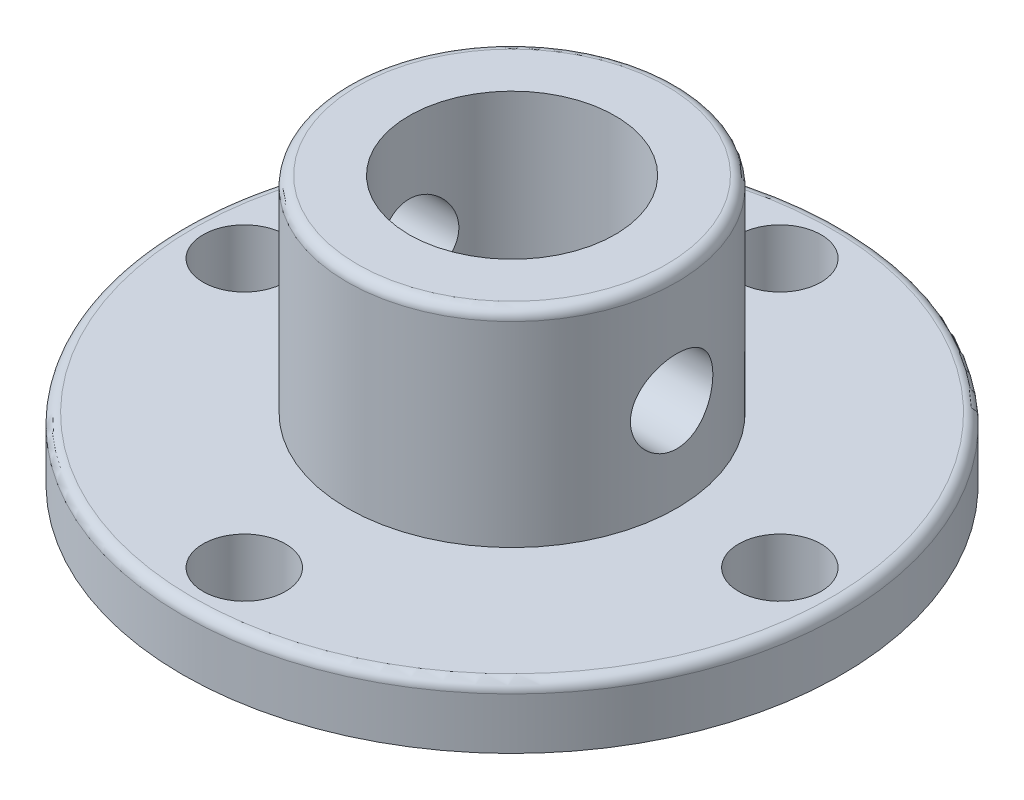
ISO-10303-21;
HEADER;
FILE_DESCRIPTION(('STEP AP214'),'2;1');
FILE_NAME('part.step','',(''),(''),'','','');
FILE_SCHEMA(('AUTOMOTIVE_DESIGN { 1 0 10303 214 1 1 1 1 }'));
ENDSEC;
DATA;
#1=APPLICATION_CONTEXT('core data for automotive mechanical design processes');
#2=APPLICATION_PROTOCOL_DEFINITION('international standard','automotive_design',2000,#1);
#3=PRODUCT_CONTEXT('',#1,'mechanical');
#4=PRODUCT('Part','Part','',(#3));
#5=PRODUCT_RELATED_PRODUCT_CATEGORY('part','',(#4));
#6=PRODUCT_DEFINITION_FORMATION('','',#4);
#7=PRODUCT_DEFINITION_CONTEXT('part definition',#1,'design');
#8=PRODUCT_DEFINITION('design','',#6,#7);
#9=PRODUCT_DEFINITION_SHAPE('','',#8);
#10=(LENGTH_UNIT() NAMED_UNIT(*) SI_UNIT(.MILLI.,.METRE.));
#11=(NAMED_UNIT(*) PLANE_ANGLE_UNIT() SI_UNIT($,.RADIAN.));
#12=(NAMED_UNIT(*) SI_UNIT($,.STERADIAN.) SOLID_ANGLE_UNIT());
#13=UNCERTAINTY_MEASURE_WITH_UNIT(LENGTH_MEASURE(1.E-05),#10,'distance_accuracy_value','');
#14=(GEOMETRIC_REPRESENTATION_CONTEXT(3) GLOBAL_UNCERTAINTY_ASSIGNED_CONTEXT((#13)) GLOBAL_UNIT_ASSIGNED_CONTEXT((#10,
#11,#12)) REPRESENTATION_CONTEXT('',''));
#15=CARTESIAN_POINT('',(0.,0.,0.));
#16=DIRECTION('',(0.,0.,1.));
#17=DIRECTION('',(1.,0.,0.));
#18=AXIS2_PLACEMENT_3D('',#15,#16,#17);
#19=CARTESIAN_POINT('',(0.,3.,0.));
#20=DIRECTION('',(0.,-1.,0.));
#21=DIRECTION('',(0.,0.,-1.));
#22=AXIS2_PLACEMENT_3D('',#19,#20,#21);
#23=CYLINDRICAL_SURFACE('',#22,16.);
#24=CARTESIAN_POINT('',(0.,2.5,0.));
#25=DIRECTION('',(0.,1.,0.));
#26=DIRECTION('',(0.,0.,1.));
#27=AXIS2_PLACEMENT_3D('',#24,#25,#26);
#28=CIRCLE('',#27,16.);
#29=CARTESIAN_POINT('',(0.,2.5,16.));
#30=VERTEX_POINT('',#29);
#31=EDGE_CURVE('E43',#30,#30,#28,.F.);
#32=ORIENTED_EDGE('',*,*,#31,.T.);
#33=EDGE_LOOP('',(#32));
#34=FACE_BOUND('',#33,.T.);
#35=CARTESIAN_POINT('',(0.,0.,0.));
#36=DIRECTION('',(0.,1.,0.));
#37=DIRECTION('',(0.,0.,1.));
#38=AXIS2_PLACEMENT_3D('',#35,#36,#37);
#39=CIRCLE('',#38,16.);
#40=CARTESIAN_POINT('',(0.,0.,16.));
#41=VERTEX_POINT('',#40);
#42=EDGE_CURVE('E52',#41,#41,#39,.T.);
#43=ORIENTED_EDGE('',*,*,#42,.T.);
#44=EDGE_LOOP('',(#43));
#45=FACE_BOUND('',#44,.T.);
#46=ADVANCED_FACE('F32',(#34,#45),#23,.T.);
#47=CARTESIAN_POINT('',(0.,3.,0.));
#48=DIRECTION('',(0.,1.,0.));
#49=DIRECTION('',(0.,0.,1.));
#50=AXIS2_PLACEMENT_3D('',#47,#48,#49);
#51=PLANE('',#50);
#52=CARTESIAN_POINT('',(0.,3.,0.));
#53=DIRECTION('',(0.,1.,0.));
#54=DIRECTION('',(0.,0.,1.));
#55=AXIS2_PLACEMENT_3D('',#52,#53,#54);
#56=CIRCLE('',#55,15.5);
#57=CARTESIAN_POINT('',(0.,3.,15.5));
#58=VERTEX_POINT('',#57);
#59=EDGE_CURVE('E47',#58,#58,#56,.T.);
#60=ORIENTED_EDGE('',*,*,#59,.T.);
#61=EDGE_LOOP('',(#60));
#62=FACE_BOUND('',#61,.T.);
#63=CARTESIAN_POINT('',(-13.,3.,0.));
#64=DIRECTION('',(0.,1.,0.));
#65=DIRECTION('',(0.,0.,1.));
#66=AXIS2_PLACEMENT_3D('',#63,#64,#65);
#67=CIRCLE('',#66,2.);
#68=CARTESIAN_POINT('',(-13.,3.,2.));
#69=VERTEX_POINT('',#68);
#70=EDGE_CURVE('E124',#69,#69,#67,.T.);
#71=ORIENTED_EDGE('',*,*,#70,.F.);
#72=EDGE_LOOP('',(#71));
#73=FACE_BOUND('',#72,.T.);
#74=CARTESIAN_POINT('',(0.,3.,13.));
#75=DIRECTION('',(0.,1.,0.));
#76=DIRECTION('',(0.,0.,1.));
#77=AXIS2_PLACEMENT_3D('',#74,#75,#76);
#78=CIRCLE('',#77,2.);
#79=CARTESIAN_POINT('',(0.,3.,15.));
#80=VERTEX_POINT('',#79);
#81=EDGE_CURVE('E128',#80,#80,#78,.T.);
#82=ORIENTED_EDGE('',*,*,#81,.F.);
#83=EDGE_LOOP('',(#82));
#84=FACE_BOUND('',#83,.T.);
#85=CARTESIAN_POINT('',(13.,3.,0.));
#86=DIRECTION('',(0.,1.,0.));
#87=DIRECTION('',(0.,0.,1.));
#88=AXIS2_PLACEMENT_3D('',#85,#86,#87);
#89=CIRCLE('',#88,2.);
#90=CARTESIAN_POINT('',(13.,3.,2.));
#91=VERTEX_POINT('',#90);
#92=EDGE_CURVE('E132',#91,#91,#89,.T.);
#93=ORIENTED_EDGE('',*,*,#92,.F.);
#94=EDGE_LOOP('',(#93));
#95=FACE_BOUND('',#94,.T.);
#96=CARTESIAN_POINT('',(0.,3.,-13.));
#97=DIRECTION('',(0.,1.,0.));
#98=DIRECTION('',(0.,0.,1.));
#99=AXIS2_PLACEMENT_3D('',#96,#97,#98);
#100=CIRCLE('',#99,2.);
#101=CARTESIAN_POINT('',(0.,3.,-11.));
#102=VERTEX_POINT('',#101);
#103=EDGE_CURVE('E136',#102,#102,#100,.T.);
#104=ORIENTED_EDGE('',*,*,#103,.F.);
#105=EDGE_LOOP('',(#104));
#106=FACE_BOUND('',#105,.T.);
#107=CARTESIAN_POINT('',(0.,3.,0.));
#108=DIRECTION('',(0.,1.,0.));
#109=DIRECTION('',(0.,0.,1.));
#110=AXIS2_PLACEMENT_3D('',#107,#108,#109);
#111=CIRCLE('',#110,8.);
#112=CARTESIAN_POINT('',(0.,3.,8.));
#113=VERTEX_POINT('',#112);
#114=EDGE_CURVE('E139',#113,#113,#111,.T.);
#115=ORIENTED_EDGE('',*,*,#114,.F.);
#116=EDGE_LOOP('',(#115));
#117=FACE_BOUND('',#116,.T.);
#118=ADVANCED_FACE('F101',(#62,#73,#84,#95,#106,#117),#51,.T.);
#119=CARTESIAN_POINT('',(0.,0.,0.));
#120=DIRECTION('',(0.,1.,0.));
#121=DIRECTION('',(0.,0.,1.));
#122=AXIS2_PLACEMENT_3D('',#119,#120,#121);
#123=PLANE('',#122);
#124=CARTESIAN_POINT('',(-13.,0.,0.));
#125=DIRECTION('',(0.,1.,0.));
#126=DIRECTION('',(0.,0.,1.));
#127=AXIS2_PLACEMENT_3D('',#124,#125,#126);
#128=CIRCLE('',#127,2.);
#129=CARTESIAN_POINT('',(-13.,0.,2.));
#130=VERTEX_POINT('',#129);
#131=EDGE_CURVE('E158',#130,#130,#128,.T.);
#132=ORIENTED_EDGE('',*,*,#131,.T.);
#133=EDGE_LOOP('',(#132));
#134=FACE_BOUND('',#133,.T.);
#135=CARTESIAN_POINT('',(0.,0.,13.));
#136=DIRECTION('',(0.,1.,0.));
#137=DIRECTION('',(0.,0.,1.));
#138=AXIS2_PLACEMENT_3D('',#135,#136,#137);
#139=CIRCLE('',#138,2.);
#140=CARTESIAN_POINT('',(0.,0.,15.));
#141=VERTEX_POINT('',#140);
#142=EDGE_CURVE('E156',#141,#141,#139,.T.);
#143=ORIENTED_EDGE('',*,*,#142,.T.);
#144=EDGE_LOOP('',(#143));
#145=FACE_BOUND('',#144,.T.);
#146=CARTESIAN_POINT('',(13.,0.,0.));
#147=DIRECTION('',(0.,1.,0.));
#148=DIRECTION('',(0.,0.,1.));
#149=AXIS2_PLACEMENT_3D('',#146,#147,#148);
#150=CIRCLE('',#149,2.);
#151=CARTESIAN_POINT('',(13.,0.,2.));
#152=VERTEX_POINT('',#151);
#153=EDGE_CURVE('E153',#152,#152,#150,.T.);
#154=ORIENTED_EDGE('',*,*,#153,.T.);
#155=EDGE_LOOP('',(#154));
#156=FACE_BOUND('',#155,.T.);
#157=CARTESIAN_POINT('',(0.,0.,-13.));
#158=DIRECTION('',(0.,1.,0.));
#159=DIRECTION('',(0.,0.,1.));
#160=AXIS2_PLACEMENT_3D('',#157,#158,#159);
#161=CIRCLE('',#160,2.);
#162=CARTESIAN_POINT('',(0.,0.,-11.));
#163=VERTEX_POINT('',#162);
#164=EDGE_CURVE('E150',#163,#163,#161,.T.);
#165=ORIENTED_EDGE('',*,*,#164,.T.);
#166=EDGE_LOOP('',(#165));
#167=FACE_BOUND('',#166,.T.);
#168=CARTESIAN_POINT('',(0.,0.,0.));
#169=DIRECTION('',(0.,1.,0.));
#170=DIRECTION('',(0.,0.,1.));
#171=AXIS2_PLACEMENT_3D('',#168,#169,#170);
#172=CIRCLE('',#171,5.);
#173=CARTESIAN_POINT('',(0.,0.,5.));
#174=VERTEX_POINT('',#173);
#175=EDGE_CURVE('E141',#174,#174,#172,.T.);
#176=ORIENTED_EDGE('',*,*,#175,.T.);
#177=EDGE_LOOP('',(#176));
#178=FACE_BOUND('',#177,.T.);
#179=ORIENTED_EDGE('',*,*,#42,.F.);
#180=EDGE_LOOP('',(#179));
#181=FACE_BOUND('',#180,.T.);
#182=ADVANCED_FACE('F100',(#134,#145,#156,#167,#178,#181),#123,.F.);
#183=CARTESIAN_POINT('',(0.,13.,0.));
#184=DIRECTION('',(0.,-1.,0.));
#185=DIRECTION('',(0.,0.,-1.));
#186=AXIS2_PLACEMENT_3D('',#183,#184,#185);
#187=CYLINDRICAL_SURFACE('',#186,8.);
#188=CARTESIAN_POINT('',(0.,12.5,0.));
#189=DIRECTION('',(0.,1.,0.));
#190=DIRECTION('',(0.,0.,1.));
#191=AXIS2_PLACEMENT_3D('',#188,#189,#190);
#192=CIRCLE('',#191,8.);
#193=CARTESIAN_POINT('',(0.,12.5,8.));
#194=VERTEX_POINT('',#193);
#195=EDGE_CURVE('E10',#194,#194,#192,.F.);
#196=ORIENTED_EDGE('',*,*,#195,.T.);
#197=EDGE_LOOP('',(#196));
#198=FACE_BOUND('',#197,.T.);
#199=CARTESIAN_POINT('',(-7.74596669241483,7.5,-2.));
#200=CARTESIAN_POINT('',(-7.74596880070288,7.61044060074126,-1.99999686287446));
#201=CARTESIAN_POINT('',(-7.74835444811678,7.72091591894282,-1.99082099639812));
#202=CARTESIAN_POINT('',(-7.75761489594051,7.93869406253881,-1.95441850037103));
#203=CARTESIAN_POINT('',(-7.76449230897304,8.04599500357455,-1.92718136539368));
#204=CARTESIAN_POINT('',(-7.7819097967692,8.25424283054975,-1.85559295970563));
#205=CARTESIAN_POINT('',(-7.79244514152366,8.35519772430857,-1.81126378228359));
#206=CARTESIAN_POINT('',(-7.81598553623007,8.54824868203191,-1.70681691300911));
#207=CARTESIAN_POINT('',(-7.82899069102791,8.64034436966417,-1.64669855084855));
#208=CARTESIAN_POINT('',(-7.856325730845,8.81508931620977,-1.5109667418495));
#209=CARTESIAN_POINT('',(-7.87067678098427,8.89751488028004,-1.43506951016324));
#210=CARTESIAN_POINT('',(-7.89890300412235,9.04860911548827,-1.27054565128053));
#211=CARTESIAN_POINT('',(-7.91277813253111,9.1172765004974,-1.18191783534425));
#212=CARTESIAN_POINT('',(-7.93872332416466,9.23982037410502,-0.992916160863164));
#213=CARTESIAN_POINT('',(-7.95076549920474,9.29347711052917,-0.892395660956097));
#214=CARTESIAN_POINT('',(-7.97144649540787,9.38304771532247,-0.683410547434211));
#215=CARTESIAN_POINT('',(-7.98008581867475,9.41896420153241,-0.574947108633554));
#216=CARTESIAN_POINT('',(-7.99283807078544,9.47131826766287,-0.355487007003331));
#217=CARTESIAN_POINT('',(-7.99703915075451,9.48813571546127,-0.244586175639182));
#218=CARTESIAN_POINT('',(-8.00074875285838,9.50300670342044,-0.0214630554102164));
#219=CARTESIAN_POINT('',(-8.00025796877363,9.50106301776768,0.0907590356304541));
#220=CARTESIAN_POINT('',(-7.99470475962828,9.47874011979988,0.310704494344773));
#221=CARTESIAN_POINT('',(-7.98974401872699,9.45877093995691,0.418472431202132));
#222=CARTESIAN_POINT('',(-7.97592669219883,9.4016229839612,0.629076494827371));
#223=CARTESIAN_POINT('',(-7.96706989918753,9.36444329169807,0.731912358740875));
#224=CARTESIAN_POINT('',(-7.94630007760717,9.27359794345035,0.930813407003612));
#225=CARTESIAN_POINT('',(-7.93436015756043,9.2197863642706,1.02680901953301));
#226=CARTESIAN_POINT('',(-7.90871923047719,9.09731545670699,1.20855124468098));
#227=CARTESIAN_POINT('',(-7.89501791721992,9.0286535451515,1.29429607017101));
#228=CARTESIAN_POINT('',(-7.86690971015616,8.8762330064141,1.45554807016991));
#229=CARTESIAN_POINT('',(-7.85249375620734,8.79211608612178,1.5307153581504));
#230=CARTESIAN_POINT('',(-7.82492034813365,8.6123200211678,1.66595275192604));
#231=CARTESIAN_POINT('',(-7.81176295284776,8.5166403364072,1.72602215209203));
#232=CARTESIAN_POINT('',(-7.78816397465319,8.31576797268083,1.82957625804519));
#233=CARTESIAN_POINT('',(-7.77773586980577,8.21053141574945,1.87297913394098));
#234=CARTESIAN_POINT('',(-7.76094912111966,7.99393162553884,1.94137124127268));
#235=CARTESIAN_POINT('',(-7.75458960648175,7.88256970881349,1.96636441310582));
#236=CARTESIAN_POINT('',(-7.74684284831312,7.6600323987815,1.99666371093214));
#237=CARTESIAN_POINT('',(-7.74532871274918,7.5489297653363,2.0024723791357));
#238=CARTESIAN_POINT('',(-7.74709874784831,7.32734245073747,1.99561359241244));
#239=CARTESIAN_POINT('',(-7.75038247681013,7.21685771363901,1.98294783827904));
#240=CARTESIAN_POINT('',(-7.76125665563648,7.00150858803624,1.93994037115013));
#241=CARTESIAN_POINT('',(-7.768775761875,6.89658181874333,1.9098912546254));
#242=CARTESIAN_POINT('',(-7.7872057461677,6.69325483371865,1.8332944653365));
#243=CARTESIAN_POINT('',(-7.79811702598891,6.59485539275573,1.78674483817004));
#244=CARTESIAN_POINT('',(-7.8223690967461,6.40524697770612,1.67741653434925));
#245=CARTESIAN_POINT('',(-7.83575334885313,6.31421692796552,1.6143374030685));
#246=CARTESIAN_POINT('',(-7.86333666457373,6.14384930975892,1.47412058586891));
#247=CARTESIAN_POINT('',(-7.87753586182776,6.06451366667994,1.39698058961088));
#248=CARTESIAN_POINT('',(-7.90557922425285,5.91775116594324,1.22852544196945));
#249=CARTESIAN_POINT('',(-7.91940561649468,5.85067194996095,1.13690390506319));
#250=CARTESIAN_POINT('',(-7.94477773290987,5.73285130643901,0.943405365389351));
#251=CARTESIAN_POINT('',(-7.95632357603169,5.68210902671344,0.841528897915183));
#252=CARTESIAN_POINT('',(-7.9757609259065,5.59884317237765,0.631116403462182));
#253=CARTESIAN_POINT('',(-7.98367864017925,5.56618857249675,0.522634762055765));
#254=CARTESIAN_POINT('',(-7.99508234716634,5.51963173231327,0.301499520637615));
#255=CARTESIAN_POINT('',(-7.99856919514738,5.50572587300877,0.188846730082482));
#256=CARTESIAN_POINT('',(-8.00068338817612,5.49726482084892,-0.0341670528866451));
#257=CARTESIAN_POINT('',(-7.99943957759977,5.50219658180918,-0.144507653932042));
#258=CARTESIAN_POINT('',(-7.99251792914887,5.5300956545887,-0.3627349928295));
#259=CARTESIAN_POINT('',(-7.98684022314338,5.55306243002634,-0.470621803561856));
#260=CARTESIAN_POINT('',(-7.97170865707778,5.61610443954172,-0.680342071289547));
#261=CARTESIAN_POINT('',(-7.96227529004785,5.65608690662876,-0.782204989161725));
#262=CARTESIAN_POINT('',(-7.94062577827316,5.75194115803914,-0.977834106083248));
#263=CARTESIAN_POINT('',(-7.92840928277515,5.80781494534097,-1.07159928253127));
#264=CARTESIAN_POINT('',(-7.90214499360574,5.93543046799226,-1.25080385684661));
#265=CARTESIAN_POINT('',(-7.88806033883329,6.00752028580766,-1.33598997659667));
#266=CARTESIAN_POINT('',(-7.85981298114379,6.16484570395469,-1.49323004054701));
#267=CARTESIAN_POINT('',(-7.84565025934604,6.25008463222232,-1.56528065015318));
#268=CARTESIAN_POINT('',(-7.81854951691005,6.43320282837892,-1.69552405294366));
#269=CARTESIAN_POINT('',(-7.80563927346578,6.53128824673051,-1.75343323883276));
#270=CARTESIAN_POINT('',(-7.78287910989656,6.73611097974964,-1.85185379317094));
#271=CARTESIAN_POINT('',(-7.77302696466427,6.84284193218769,-1.8923778195043));
#272=CARTESIAN_POINT('',(-7.75903817501475,7.04115402367032,-1.948845057142));
#273=CARTESIAN_POINT('',(-7.75417326006998,7.13178632877227,-1.96798634119376));
#274=CARTESIAN_POINT('',(-7.7476367716524,7.31493773799538,-1.99356458514354));
#275=CARTESIAN_POINT('',(-7.74596492578215,7.4074566804888,-2.0000026287435));
#276=CARTESIAN_POINT('',(-7.74596669241483,7.5,-2.));
#277=B_SPLINE_CURVE_WITH_KNOTS('',3,(#199,#200,#201,#202,#203,#204,#205,#206,#207,#208,#209,
#210,#211,#212,#213,#214,#215,#216,#217,#218,#219,#220,#221,#222,#223,#224,#225,#226,#227,#228,
#229,#230,#231,#232,#233,#234,#235,#236,#237,#238,#239,#240,#241,#242,#243,#244,#245,#246,#247,
#248,#249,#250,#251,#252,#253,#254,#255,#256,#257,#258,#259,#260,#261,#262,#263,#264,#265,#266,
#267,#268,#269,#270,#271,#272,#273,#274,#275,#276),.UNSPECIFIED.,.T.,.F.,(4,2,2,2,2,2,2,2,2,2,2,
2,2,2,2,2,2,2,2,2,2,2,2,2,2,2,2,2,2,2,2,2,2,2,2,2,2,2,4),(0.,0.330981953388908,
0.662156593142932,0.992904581732817,1.32366661404383,1.66099163354381,1.99834817183893,
2.34041197118336,2.68242527877674,3.01751000796277,3.35254518932816,3.68014610151157,
4.00776445379829,4.33834299403555,4.6689790837513,5.00856373257529,5.34816424959841,
5.68941145606722,6.03058560103638,6.36274859809374,6.69488101747042,7.02157924007365,
7.34831617137134,7.68146276687326,8.01466415108036,8.35620264772255,8.69772332575643,
9.03673658245543,9.3756843912723,9.70546756901965,10.0352409390158,10.3632390124777,
10.6912784459046,11.0271767726566,11.3631602525241,11.7054118182895,12.0474137709606,
12.3247826174462,12.6021278008238),.UNSPECIFIED.);
#278=CARTESIAN_POINT('',(-7.74596669241483,7.5,-2.));
#279=VERTEX_POINT('',#278);
#280=EDGE_CURVE('E90',#279,#279,#277,.T.);
#281=ORIENTED_EDGE('',*,*,#280,.T.);
#282=EDGE_LOOP('',(#281));
#283=FACE_BOUND('',#282,.T.);
#284=CARTESIAN_POINT('',(7.74596669241483,7.5,-2.));
#285=CARTESIAN_POINT('',(7.74596880070288,7.38955939925874,-1.99999686287446));
#286=CARTESIAN_POINT('',(7.74835444811678,7.27908408105718,-1.99082099639812));
#287=CARTESIAN_POINT('',(7.75761489594051,7.06130593746119,-1.95441850037103));
#288=CARTESIAN_POINT('',(7.76449230897304,6.95400499642545,-1.92718136539368));
#289=CARTESIAN_POINT('',(7.7819097967692,6.74575716945025,-1.85559295970563));
#290=CARTESIAN_POINT('',(7.79244514152366,6.64480227569143,-1.81126378228359));
#291=CARTESIAN_POINT('',(7.81598553623007,6.45175131796809,-1.70681691300911));
#292=CARTESIAN_POINT('',(7.82899069102791,6.35965563033583,-1.64669855084855));
#293=CARTESIAN_POINT('',(7.856325730845,6.18491068379023,-1.51096674184951));
#294=CARTESIAN_POINT('',(7.87067678098427,6.10248511971996,-1.43506951016324));
#295=CARTESIAN_POINT('',(7.89890300412235,5.95139088451173,-1.27054565128053));
#296=CARTESIAN_POINT('',(7.91277813253111,5.8827234995026,-1.18191783534425));
#297=CARTESIAN_POINT('',(7.93872332416466,5.76017962589498,-0.992916160863165));
#298=CARTESIAN_POINT('',(7.95076549920474,5.70652288947083,-0.892395660956097));
#299=CARTESIAN_POINT('',(7.97144649540787,5.61695228467753,-0.683410547434211));
#300=CARTESIAN_POINT('',(7.98008581867475,5.58103579846759,-0.574947108633553));
#301=CARTESIAN_POINT('',(7.99283807078544,5.52868173233713,-0.355487007003329));
#302=CARTESIAN_POINT('',(7.99703915075451,5.51186428453873,-0.24458617563918));
#303=CARTESIAN_POINT('',(8.00074875285838,5.49699329657956,-0.0214630554102154));
#304=CARTESIAN_POINT('',(8.00025796877363,5.49893698223232,0.0907590356304549));
#305=CARTESIAN_POINT('',(7.99470475962828,5.52125988020012,0.310704494344775));
#306=CARTESIAN_POINT('',(7.98974401872699,5.54122906004308,0.418472431202134));
#307=CARTESIAN_POINT('',(7.97592669219883,5.5983770160388,0.629076494827373));
#308=CARTESIAN_POINT('',(7.96706989918753,5.63555670830193,0.731912358740876));
#309=CARTESIAN_POINT('',(7.94630007760717,5.72640205654965,0.930813407003613));
#310=CARTESIAN_POINT('',(7.93436015756043,5.7802136357294,1.02680901953301));
#311=CARTESIAN_POINT('',(7.90871923047719,5.90268454329301,1.20855124468098));
#312=CARTESIAN_POINT('',(7.89501791721992,5.9713464548485,1.29429607017101));
#313=CARTESIAN_POINT('',(7.86690971015616,6.1237669935859,1.45554807016991));
#314=CARTESIAN_POINT('',(7.85249375620734,6.20788391387822,1.5307153581504));
#315=CARTESIAN_POINT('',(7.82492034813365,6.3876799788322,1.66595275192604));
#316=CARTESIAN_POINT('',(7.81176295284776,6.4833596635928,1.72602215209203));
#317=CARTESIAN_POINT('',(7.78816397465319,6.68423202731917,1.8295762580452));
#318=CARTESIAN_POINT('',(7.77773586980577,6.78946858425056,1.87297913394098));
#319=CARTESIAN_POINT('',(7.76094912111966,7.00606837446116,1.94137124127268));
#320=CARTESIAN_POINT('',(7.75458960648175,7.11743029118651,1.96636441310582));
#321=CARTESIAN_POINT('',(7.74684284831313,7.3399676012185,1.99666371093214));
#322=CARTESIAN_POINT('',(7.74532871274919,7.4510702346637,2.0024723791357));
#323=CARTESIAN_POINT('',(7.74709874784831,7.67265754926253,1.99561359241244));
#324=CARTESIAN_POINT('',(7.75038247681013,7.78314228636099,1.98294783827904));
#325=CARTESIAN_POINT('',(7.76125665563648,7.99849141196376,1.93994037115013));
#326=CARTESIAN_POINT('',(7.768775761875,8.10341818125668,1.9098912546254));
#327=CARTESIAN_POINT('',(7.7872057461677,8.30674516628135,1.8332944653365));
#328=CARTESIAN_POINT('',(7.79811702598891,8.40514460724427,1.78674483817004));
#329=CARTESIAN_POINT('',(7.8223690967461,8.59475302229388,1.67741653434925));
#330=CARTESIAN_POINT('',(7.83575334885313,8.68578307203448,1.6143374030685));
#331=CARTESIAN_POINT('',(7.86333666457373,8.85615069024108,1.47412058586891));
#332=CARTESIAN_POINT('',(7.87753586182776,8.93548633332006,1.39698058961088));
#333=CARTESIAN_POINT('',(7.90557922425285,9.08224883405676,1.22852544196945));
#334=CARTESIAN_POINT('',(7.91940561649468,9.14932805003905,1.13690390506318));
#335=CARTESIAN_POINT('',(7.94477773290987,9.26714869356099,0.94340536538935));
#336=CARTESIAN_POINT('',(7.95632357603169,9.31789097328656,0.841528897915181));
#337=CARTESIAN_POINT('',(7.9757609259065,9.40115682762235,0.631116403462181));
#338=CARTESIAN_POINT('',(7.98367864017925,9.43381142750325,0.522634762055765));
#339=CARTESIAN_POINT('',(7.99508234716634,9.48036826768673,0.301499520637615));
#340=CARTESIAN_POINT('',(7.99856919514738,9.49427412699123,0.188846730082481));
#341=CARTESIAN_POINT('',(8.00068338817612,9.50273517915108,-0.0341670528866464));
#342=CARTESIAN_POINT('',(7.99943957759977,9.49780341819082,-0.144507653932044));
#343=CARTESIAN_POINT('',(7.99251792914887,9.4699043454113,-0.362734992829502));
#344=CARTESIAN_POINT('',(7.98684022314338,9.44693756997366,-0.470621803561857));
#345=CARTESIAN_POINT('',(7.97170865707778,9.38389556045828,-0.680342071289548));
#346=CARTESIAN_POINT('',(7.96227529004785,9.34391309337124,-0.782204989161725));
#347=CARTESIAN_POINT('',(7.94062577827316,9.24805884196086,-0.977834106083247));
#348=CARTESIAN_POINT('',(7.92840928277515,9.19218505465903,-1.07159928253127));
#349=CARTESIAN_POINT('',(7.90214499360574,9.06456953200773,-1.25080385684661));
#350=CARTESIAN_POINT('',(7.88806033883329,8.99247971419234,-1.33598997659667));
#351=CARTESIAN_POINT('',(7.85981298114379,8.83515429604531,-1.49323004054701));
#352=CARTESIAN_POINT('',(7.84565025934604,8.74991536777767,-1.56528065015318));
#353=CARTESIAN_POINT('',(7.81854951691005,8.56679717162108,-1.69552405294366));
#354=CARTESIAN_POINT('',(7.80563927346578,8.46871175326949,-1.75343323883276));
#355=CARTESIAN_POINT('',(7.78287910989656,8.26388902025036,-1.85185379317094));
#356=CARTESIAN_POINT('',(7.77302696466428,8.15715806781231,-1.8923778195043));
#357=CARTESIAN_POINT('',(7.75903817501475,7.95884597632968,-1.948845057142));
#358=CARTESIAN_POINT('',(7.75417326006998,7.86821367122772,-1.96798634119376));
#359=CARTESIAN_POINT('',(7.7476367716524,7.68506226200462,-1.99356458514354));
#360=CARTESIAN_POINT('',(7.74596492578215,7.5925433195112,-2.0000026287435));
#361=CARTESIAN_POINT('',(7.74596669241483,7.5,-2.));
#362=B_SPLINE_CURVE_WITH_KNOTS('',3,(#284,#285,#286,#287,#288,#289,#290,#291,#292,#293,#294,
#295,#296,#297,#298,#299,#300,#301,#302,#303,#304,#305,#306,#307,#308,#309,#310,#311,#312,#313,
#314,#315,#316,#317,#318,#319,#320,#321,#322,#323,#324,#325,#326,#327,#328,#329,#330,#331,#332,
#333,#334,#335,#336,#337,#338,#339,#340,#341,#342,#343,#344,#345,#346,#347,#348,#349,#350,#351,
#352,#353,#354,#355,#356,#357,#358,#359,#360,#361),.UNSPECIFIED.,.T.,.F.,(4,2,2,2,2,2,2,2,2,2,2,
2,2,2,2,2,2,2,2,2,2,2,2,2,2,2,2,2,2,2,2,2,2,2,2,2,2,2,4),(0.,0.330981953388909,
0.662156593142932,0.992904581732817,1.32366661404383,1.66099163354381,1.99834817183893,
2.34041197118336,2.68242527877674,3.01751000796277,3.35254518932816,3.68014610151158,
4.00776445379829,4.33834299403556,4.66897908375131,5.00856373257529,5.34816424959842,
5.68941145606722,6.03058560103638,6.36274859809374,6.69488101747042,7.02157924007366,
7.34831617137134,7.68146276687326,8.01466415108036,8.35620264772255,8.69772332575643,
9.03673658245543,9.37568439127231,9.70546756901966,10.0352409390158,10.3632390124777,
10.6912784459046,11.0271767726566,11.3631602525241,11.7054118182895,12.0474137709606,
12.3247826174462,12.6021278008238),.UNSPECIFIED.);
#363=CARTESIAN_POINT('',(7.74596669241483,7.5,-2.));
#364=VERTEX_POINT('',#363);
#365=EDGE_CURVE('E61',#364,#364,#362,.T.);
#366=ORIENTED_EDGE('',*,*,#365,.T.);
#367=EDGE_LOOP('',(#366));
#368=FACE_BOUND('',#367,.T.);
#369=ORIENTED_EDGE('',*,*,#114,.T.);
#370=EDGE_LOOP('',(#369));
#371=FACE_BOUND('',#370,.T.);
#372=ADVANCED_FACE('F95',(#198,#283,#368,#371),#187,.T.);
#373=CARTESIAN_POINT('',(0.,13.,0.));
#374=DIRECTION('',(0.,1.,0.));
#375=DIRECTION('',(0.,0.,1.));
#376=AXIS2_PLACEMENT_3D('',#373,#374,#375);
#377=PLANE('',#376);
#378=CARTESIAN_POINT('',(0.,13.,0.));
#379=DIRECTION('',(0.,1.,0.));
#380=DIRECTION('',(0.,0.,1.));
#381=AXIS2_PLACEMENT_3D('',#378,#379,#380);
#382=CIRCLE('',#381,7.5);
#383=CARTESIAN_POINT('',(0.,13.,7.5));
#384=VERTEX_POINT('',#383);
#385=EDGE_CURVE('E39',#384,#384,#382,.T.);
#386=ORIENTED_EDGE('',*,*,#385,.T.);
#387=EDGE_LOOP('',(#386));
#388=FACE_BOUND('',#387,.T.);
#389=CARTESIAN_POINT('',(0.,13.,0.));
#390=DIRECTION('',(0.,1.,0.));
#391=DIRECTION('',(0.,0.,1.));
#392=AXIS2_PLACEMENT_3D('',#389,#390,#391);
#393=CIRCLE('',#392,5.);
#394=CARTESIAN_POINT('',(0.,13.,5.));
#395=VERTEX_POINT('',#394);
#396=EDGE_CURVE('E146',#395,#395,#393,.T.);
#397=ORIENTED_EDGE('',*,*,#396,.F.);
#398=EDGE_LOOP('',(#397));
#399=FACE_BOUND('',#398,.T.);
#400=ADVANCED_FACE('F99',(#388,#399),#377,.T.);
#401=CARTESIAN_POINT('',(0.,0.,0.));
#402=DIRECTION('',(0.,1.,0.));
#403=DIRECTION('',(0.,0.,1.));
#404=AXIS2_PLACEMENT_3D('',#401,#402,#403);
#405=CYLINDRICAL_SURFACE('',#404,5.);
#406=CARTESIAN_POINT('',(-4.58257569495584,7.5,-2.));
#407=CARTESIAN_POINT('',(-4.58258022779737,7.39287631028704,-1.99999540068022));
#408=CARTESIAN_POINT('',(-4.58638433797122,7.28557370566816,-1.99134173553407));
#409=CARTESIAN_POINT('',(-4.601110833066,7.07406091590043,-1.95706710874823));
#410=CARTESIAN_POINT('',(-4.61205140628347,6.96985934566148,-1.93140279032341));
#411=CARTESIAN_POINT('',(-4.63960410719222,6.76794819102917,-1.86423554476216));
#412=CARTESIAN_POINT('',(-4.65619484260882,6.67021575670878,-1.82279228998551));
#413=CARTESIAN_POINT('',(-4.69314677188873,6.4831146451377,-1.72542013194152));
#414=CARTESIAN_POINT('',(-4.71350714220611,6.39374414747589,-1.66949439157707));
#415=CARTESIAN_POINT('',(-4.75700861562336,6.22073968545567,-1.54132201423254));
#416=CARTESIAN_POINT('',(-4.78023917022606,6.13764360060276,-1.46837936836551));
#417=CARTESIAN_POINT('',(-4.82612457915278,5.9844709791442,-1.30970909513215));
#418=CARTESIAN_POINT('',(-4.84877922991761,5.9143989922903,-1.22397701877347));
#419=CARTESIAN_POINT('',(-4.89203407641395,5.78659360969029,-1.03800631337303));
#420=CARTESIAN_POINT('',(-4.9125180361257,5.72945570031406,-0.937328966419093));
#421=CARTESIAN_POINT('',(-4.94803927702516,5.63315642982621,-0.726825322068638));
#422=CARTESIAN_POINT('',(-4.96307877403249,5.59398775375113,-0.617002769076883));
#423=CARTESIAN_POINT('',(-4.98538324990609,5.53665851400691,-0.396966427039753));
#424=CARTESIAN_POINT('',(-4.99298936770628,5.51757268602978,-0.287028984858316));
#425=CARTESIAN_POINT('',(-5.00080310687431,5.49797151421855,-0.0652663285839616));
#426=CARTESIAN_POINT('',(-5.00101348770556,5.4974492440342,0.0465581658394117));
#427=CARTESIAN_POINT('',(-4.99421962820612,5.5144827698042,0.262232494702089));
#428=CARTESIAN_POINT('',(-4.98761996771485,5.53102477275471,0.366177452870457));
#429=CARTESIAN_POINT('',(-4.96849291469141,5.57999287630297,0.569673109221914));
#430=CARTESIAN_POINT('',(-4.95596508721342,5.61242014239846,0.669223484391239));
#431=CARTESIAN_POINT('',(-4.92596824457467,5.69263648287826,0.862897938510558));
#432=CARTESIAN_POINT('',(-4.90842760466223,5.74064971481538,0.956917623378896));
#433=CARTESIAN_POINT('',(-4.87014585180275,5.85046500691916,1.13580815074131));
#434=CARTESIAN_POINT('',(-4.84940364267149,5.91227179310017,1.22067584271796));
#435=CARTESIAN_POINT('',(-4.80521637176122,6.05264913594388,1.38476882799018));
#436=CARTESIAN_POINT('',(-4.78168326511759,6.1320538925728,1.46325784526632));
#437=CARTESIAN_POINT('',(-4.73561660973263,6.302990571832,1.60610741539265));
#438=CARTESIAN_POINT('',(-4.71308339008076,6.39452644819561,1.67046334378698));
#439=CARTESIAN_POINT('',(-4.67096897409023,6.59041902237394,1.78490418871927));
#440=CARTESIAN_POINT('',(-4.65148914057708,6.69506483033865,1.83453465163626));
#441=CARTESIAN_POINT('',(-4.61887590344084,6.91221549031222,1.91517625986646));
#442=CARTESIAN_POINT('',(-4.60573837891311,7.02471518472659,1.94619949837798));
#443=CARTESIAN_POINT('',(-4.58829759702716,7.24703577746744,1.9869549488549));
#444=CARTESIAN_POINT('',(-4.58350366456138,7.35660044712856,1.99787209681454));
#445=CARTESIAN_POINT('',(-4.58189497869038,7.57607720775956,2.00156132644289));
#446=CARTESIAN_POINT('',(-4.58507780560362,7.68598918327566,1.99433891059128));
#447=CARTESIAN_POINT('',(-4.59856044359114,7.89645893495694,1.96303289479003));
#448=CARTESIAN_POINT('',(-4.60844457798302,7.99719293740006,1.93993306202386));
#449=CARTESIAN_POINT('',(-4.6337005102734,8.19328840478546,1.87880418691087));
#450=CARTESIAN_POINT('',(-4.64907352488598,8.28864867310715,1.84077183430228));
#451=CARTESIAN_POINT('',(-4.68433781860101,8.47560235779566,1.74913563948157));
#452=CARTESIAN_POINT('',(-4.70438704639177,8.56688618869454,1.69496286826465));
#453=CARTESIAN_POINT('',(-4.74650385157795,8.73948298744159,1.57316522444182));
#454=CARTESIAN_POINT('',(-4.76857224896045,8.82079187279545,1.50553487348189));
#455=CARTESIAN_POINT('',(-4.81420915971416,8.97737340859937,1.35284421168058));
#456=CARTESIAN_POINT('',(-4.83776807285233,9.0517565652916,1.26686542944543));
#457=CARTESIAN_POINT('',(-4.88219794567532,9.18517707660977,1.0830836333685));
#458=CARTESIAN_POINT('',(-4.90306879593136,9.24421380659512,0.985280138466607));
#459=CARTESIAN_POINT('',(-4.9398371590039,9.34504762646334,0.780279934003013));
#460=CARTESIAN_POINT('',(-4.9557358624066,9.38684884417366,0.673085480998743));
#461=CARTESIAN_POINT('',(-4.98072713468904,9.45154885239976,0.452393590914545));
#462=CARTESIAN_POINT('',(-4.98982339706103,9.47445790141069,0.338899610276817));
#463=CARTESIAN_POINT('',(-4.99979008211858,9.49950470165284,0.116816510362613));
#464=CARTESIAN_POINT('',(-5.00115846749745,9.50290012856203,0.00839049265208431));
#465=CARTESIAN_POINT('',(-4.99686042373721,9.49214452061653,-0.207433835792268));
#466=CARTESIAN_POINT('',(-4.99119505948774,9.47799614184442,-0.314832299614389));
#467=CARTESIAN_POINT('',(-4.97371513381836,9.43345321200012,-0.522170901733398));
#468=CARTESIAN_POINT('',(-4.96209480698998,9.40357105524345,-0.62223880386487));
#469=CARTESIAN_POINT('',(-4.93394947767358,9.32894719411893,-0.815922355542604));
#470=CARTESIAN_POINT('',(-4.91742357062859,9.28420274906091,-0.909536811189123));
#471=CARTESIAN_POINT('',(-4.88018094611867,9.17889680664677,-1.09220303880515));
#472=CARTESIAN_POINT('',(-4.859311306872,9.11772372467486,-1.18087037518738));
#473=CARTESIAN_POINT('',(-4.8158940222708,8.98221146125301,-1.34705404014793));
#474=CARTESIAN_POINT('',(-4.79334568464253,8.90786683039178,-1.42456572919735));
#475=CARTESIAN_POINT('',(-4.7473776736768,8.74268485315134,-1.57120121894449));
#476=CARTESIAN_POINT('',(-4.72399047228096,8.6511114248559,-1.63950871002775));
#477=CARTESIAN_POINT('',(-4.68049656850749,8.45705756427917,-1.75984762763149));
#478=CARTESIAN_POINT('',(-4.66039025195448,8.35457585154646,-1.81187714055767));
#479=CARTESIAN_POINT('',(-4.62758914239063,8.1509638135298,-1.89399048451634));
#480=CARTESIAN_POINT('',(-4.61439096680415,8.05053839728756,-1.92562535665267));
#481=CARTESIAN_POINT('',(-4.5944582603412,7.84551095850736,-1.97271990928489));
#482=CARTESIAN_POINT('',(-4.58770572290435,7.74092142657564,-1.98822466191608));
#483=CARTESIAN_POINT('',(-4.5839176394209,7.61322176088848,-1.99692202185513));
#484=CARTESIAN_POINT('',(-4.58341531117284,7.59059851964357,-1.99807530751895));
#485=CARTESIAN_POINT('',(-4.58274384722723,7.54531952320278,-1.9996148112425));
#486=CARTESIAN_POINT('',(-4.5825747359592,7.52266376574484,-2.0000009730612));
#487=CARTESIAN_POINT('',(-4.58257569495584,7.5,-2.));
#488=B_SPLINE_CURVE_WITH_KNOTS('',3,(#406,#407,#408,#409,#410,#411,#412,#413,#414,#415,#416,
#417,#418,#419,#420,#421,#422,#423,#424,#425,#426,#427,#428,#429,#430,#431,#432,#433,#434,#435,
#436,#437,#438,#439,#440,#441,#442,#443,#444,#445,#446,#447,#448,#449,#450,#451,#452,#453,#454,
#455,#456,#457,#458,#459,#460,#461,#462,#463,#464,#465,#466,#467,#468,#469,#470,#471,#472,#473,
#474,#475,#476,#477,#478,#479,#480,#481,#482,#483,#484,#485,#486,#487),.UNSPECIFIED.,.T.,.F.,(4,
2,2,2,2,2,2,2,2,2,2,2,2,2,2,2,2,2,2,2,2,2,2,2,2,2,2,2,2,2,2,2,2,2,2,2,2,2,2,2,4),(0.,
0.321277648767654,0.643377335822245,0.96427082329339,1.28509428823861,1.62255618284425,
1.96013574348342,2.31102669091428,2.6617746696948,2.99554182887184,3.32918445305672,
3.64408644830302,3.9590115512906,4.27868300234898,4.59846414940031,4.93924044081356,
5.28012807127127,5.63064458717258,5.98093304800101,6.30982147524421,6.6386101490794,
6.94867248085145,7.25880358651638,7.58151154652701,7.90435114525849,8.2510373424698,
8.59773764852748,8.94435487312813,9.29078375954136,9.61461039755953,9.93838801512602,
10.2522199444335,10.5661097782859,10.8938705113993,11.2217671656421,11.5699625328561,
11.9181988175919,12.2351666081908,12.5512463021924,12.619212852096,12.6871843847255),.UNSPECIFIED.);
#489=CARTESIAN_POINT('',(-4.58257569495584,7.5,-2.));
#490=VERTEX_POINT('',#489);
#491=EDGE_CURVE('E53',#490,#490,#488,.T.);
#492=ORIENTED_EDGE('',*,*,#491,.T.);
#493=EDGE_LOOP('',(#492));
#494=FACE_BOUND('',#493,.T.);
#495=CARTESIAN_POINT('',(4.58257569495584,7.5,-2.));
#496=CARTESIAN_POINT('',(4.58258022779737,7.60712368971296,-1.99999540068022));
#497=CARTESIAN_POINT('',(4.58638433797122,7.71442629433184,-1.99134173553407));
#498=CARTESIAN_POINT('',(4.601110833066,7.92593908409957,-1.95706710874823));
#499=CARTESIAN_POINT('',(4.61205140628347,8.03014065433852,-1.93140279032341));
#500=CARTESIAN_POINT('',(4.63960410719222,8.23205180897082,-1.86423554476216));
#501=CARTESIAN_POINT('',(4.65619484260882,8.32978424329122,-1.82279228998551));
#502=CARTESIAN_POINT('',(4.69314677188873,8.5168853548623,-1.72542013194152));
#503=CARTESIAN_POINT('',(4.71350714220611,8.60625585252411,-1.66949439157707));
#504=CARTESIAN_POINT('',(4.75700861562336,8.77926031454433,-1.54132201423254));
#505=CARTESIAN_POINT('',(4.78023917022606,8.86235639939724,-1.46837936836551));
#506=CARTESIAN_POINT('',(4.82612457915278,9.0155290208558,-1.30970909513215));
#507=CARTESIAN_POINT('',(4.84877922991761,9.08560100770971,-1.22397701877347));
#508=CARTESIAN_POINT('',(4.89203407641395,9.21340639030971,-1.03800631337303));
#509=CARTESIAN_POINT('',(4.9125180361257,9.27054429968594,-0.937328966419093));
#510=CARTESIAN_POINT('',(4.94803927702516,9.36684357017379,-0.726825322068638));
#511=CARTESIAN_POINT('',(4.96307877403249,9.40601224624887,-0.617002769076883));
#512=CARTESIAN_POINT('',(4.98538324990609,9.46334148599309,-0.396966427039754));
#513=CARTESIAN_POINT('',(4.99298936770628,9.48242731397022,-0.287028984858317));
#514=CARTESIAN_POINT('',(5.00080310687431,9.50202848578145,-0.0652663285839626));
#515=CARTESIAN_POINT('',(5.00101348770556,9.5025507559658,0.0465581658394104));
#516=CARTESIAN_POINT('',(4.99421962820612,9.4855172301958,0.262232494702088));
#517=CARTESIAN_POINT('',(4.98761996771485,9.46897522724528,0.366177452870456));
#518=CARTESIAN_POINT('',(4.96849291469141,9.42000712369703,0.569673109221913));
#519=CARTESIAN_POINT('',(4.95596508721342,9.38757985760154,0.669223484391238));
#520=CARTESIAN_POINT('',(4.92596824457467,9.30736351712174,0.862897938510557));
#521=CARTESIAN_POINT('',(4.90842760466223,9.25935028518462,0.956917623378894));
#522=CARTESIAN_POINT('',(4.87014585180275,9.14953499308084,1.13580815074131));
#523=CARTESIAN_POINT('',(4.84940364267149,9.08772820689983,1.22067584271796));
#524=CARTESIAN_POINT('',(4.80521637176122,8.94735086405612,1.38476882799017));
#525=CARTESIAN_POINT('',(4.78168326511759,8.8679461074272,1.46325784526632));
#526=CARTESIAN_POINT('',(4.73561660973263,8.697009428168,1.60610741539265));
#527=CARTESIAN_POINT('',(4.71308339008076,8.6054735518044,1.67046334378698));
#528=CARTESIAN_POINT('',(4.67096897409023,8.40958097762606,1.78490418871927));
#529=CARTESIAN_POINT('',(4.65148914057708,8.30493516966135,1.83453465163626));
#530=CARTESIAN_POINT('',(4.61887590344084,8.08778450968778,1.91517625986646));
#531=CARTESIAN_POINT('',(4.60573837891311,7.97528481527341,1.94619949837798));
#532=CARTESIAN_POINT('',(4.58829759702716,7.75296422253256,1.9869549488549));
#533=CARTESIAN_POINT('',(4.58350366456138,7.64339955287144,1.99787209681454));
#534=CARTESIAN_POINT('',(4.58189497869038,7.42392279224044,2.00156132644289));
#535=CARTESIAN_POINT('',(4.58507780560362,7.31401081672435,1.99433891059128));
#536=CARTESIAN_POINT('',(4.59856044359113,7.10354106504306,1.96303289479003));
#537=CARTESIAN_POINT('',(4.60844457798301,7.00280706259994,1.93993306202386));
#538=CARTESIAN_POINT('',(4.6337005102734,6.80671159521455,1.87880418691087));
#539=CARTESIAN_POINT('',(4.64907352488598,6.71135132689285,1.84077183430228));
#540=CARTESIAN_POINT('',(4.68433781860101,6.52439764220434,1.74913563948157));
#541=CARTESIAN_POINT('',(4.70438704639177,6.43311381130547,1.69496286826465));
#542=CARTESIAN_POINT('',(4.74650385157795,6.26051701255841,1.57316522444182));
#543=CARTESIAN_POINT('',(4.76857224896045,6.17920812720455,1.50553487348189));
#544=CARTESIAN_POINT('',(4.81420915971416,6.02262659140063,1.35284421168058));
#545=CARTESIAN_POINT('',(4.83776807285233,5.9482434347084,1.26686542944544));
#546=CARTESIAN_POINT('',(4.88219794567532,5.81482292339023,1.08308363336851));
#547=CARTESIAN_POINT('',(4.90306879593135,5.75578619340488,0.985280138466608));
#548=CARTESIAN_POINT('',(4.9398371590039,5.65495237353666,0.780279934003015));
#549=CARTESIAN_POINT('',(4.9557358624066,5.61315115582634,0.673085480998745));
#550=CARTESIAN_POINT('',(4.98072713468904,5.54845114760024,0.452393590914548));
#551=CARTESIAN_POINT('',(4.98982339706103,5.52554209858931,0.33889961027682));
#552=CARTESIAN_POINT('',(4.99979008211858,5.50049529834716,0.116816510362615));
#553=CARTESIAN_POINT('',(5.00115846749745,5.49709987143797,0.00839049265208722));
#554=CARTESIAN_POINT('',(4.99686042373721,5.50785547938346,-0.207433835792265));
#555=CARTESIAN_POINT('',(4.99119505948774,5.52200385815558,-0.314832299614386));
#556=CARTESIAN_POINT('',(4.97371513381836,5.56654678799988,-0.522170901733397));
#557=CARTESIAN_POINT('',(4.96209480698998,5.59642894475655,-0.622238803864868));
#558=CARTESIAN_POINT('',(4.93394947767358,5.67105280588107,-0.815922355542602));
#559=CARTESIAN_POINT('',(4.91742357062859,5.71579725093909,-0.909536811189121));
#560=CARTESIAN_POINT('',(4.88018094611867,5.82110319335323,-1.09220303880515));
#561=CARTESIAN_POINT('',(4.859311306872,5.88227627532513,-1.18087037518738));
#562=CARTESIAN_POINT('',(4.8158940222708,6.01778853874699,-1.34705404014793));
#563=CARTESIAN_POINT('',(4.79334568464253,6.09213316960822,-1.42456572919735));
#564=CARTESIAN_POINT('',(4.7473776736768,6.25731514684866,-1.57120121894449));
#565=CARTESIAN_POINT('',(4.72399047228096,6.3488885751441,-1.63950871002775));
#566=CARTESIAN_POINT('',(4.68049656850749,6.54294243572083,-1.75984762763149));
#567=CARTESIAN_POINT('',(4.66039025195448,6.64542414845354,-1.81187714055767));
#568=CARTESIAN_POINT('',(4.62758914239063,6.8490361864702,-1.89399048451634));
#569=CARTESIAN_POINT('',(4.61439096680415,6.94946160271244,-1.92562535665267));
#570=CARTESIAN_POINT('',(4.5944582603412,7.15448904149264,-1.97271990928489));
#571=CARTESIAN_POINT('',(4.58770572290435,7.25907857342435,-1.98822466191608));
#572=CARTESIAN_POINT('',(4.5839176394209,7.38677823911152,-1.99692202185513));
#573=CARTESIAN_POINT('',(4.58341531117284,7.40940148035643,-1.99807530751895));
#574=CARTESIAN_POINT('',(4.58274384722723,7.45468047679722,-1.9996148112425));
#575=CARTESIAN_POINT('',(4.5825747359592,7.47733623425516,-2.0000009730612));
#576=CARTESIAN_POINT('',(4.58257569495584,7.5,-2.));
#577=B_SPLINE_CURVE_WITH_KNOTS('',3,(#495,#496,#497,#498,#499,#500,#501,#502,#503,#504,#505,
#506,#507,#508,#509,#510,#511,#512,#513,#514,#515,#516,#517,#518,#519,#520,#521,#522,#523,#524,
#525,#526,#527,#528,#529,#530,#531,#532,#533,#534,#535,#536,#537,#538,#539,#540,#541,#542,#543,
#544,#545,#546,#547,#548,#549,#550,#551,#552,#553,#554,#555,#556,#557,#558,#559,#560,#561,#562,
#563,#564,#565,#566,#567,#568,#569,#570,#571,#572,#573,#574,#575,#576),.UNSPECIFIED.,.T.,.F.,(4,
2,2,2,2,2,2,2,2,2,2,2,2,2,2,2,2,2,2,2,2,2,2,2,2,2,2,2,2,2,2,2,2,2,2,2,2,2,2,2,4),(0.,
0.321277648767654,0.643377335822245,0.96427082329339,1.28509428823861,1.62255618284425,
1.96013574348342,2.31102669091428,2.6617746696948,2.99554182887183,3.32918445305672,
3.64408644830302,3.95901155129059,4.27868300234898,4.59846414940031,4.93924044081356,
5.28012807127127,5.63064458717257,5.98093304800101,6.30982147524421,6.63861014907939,
6.94867248085145,7.25880358651638,7.58151154652701,7.90435114525849,8.25103734246979,
8.59773764852748,8.94435487312812,9.29078375954136,9.61461039755953,9.93838801512602,
10.2522199444335,10.5661097782859,10.8938705113992,11.2217671656421,11.5699625328561,
11.9181988175919,12.2351666081908,12.5512463021924,12.619212852096,12.6871843847255),.UNSPECIFIED.);
#578=CARTESIAN_POINT('',(4.58257569495584,7.5,-2.));
#579=VERTEX_POINT('',#578);
#580=EDGE_CURVE('E62',#579,#579,#577,.T.);
#581=ORIENTED_EDGE('',*,*,#580,.T.);
#582=EDGE_LOOP('',(#581));
#583=FACE_BOUND('',#582,.T.);
#584=ORIENTED_EDGE('',*,*,#175,.F.);
#585=EDGE_LOOP('',(#584));
#586=FACE_BOUND('',#585,.T.);
#587=ORIENTED_EDGE('',*,*,#396,.T.);
#588=EDGE_LOOP('',(#587));
#589=FACE_BOUND('',#588,.T.);
#590=ADVANCED_FACE('F67',(#494,#583,#586,#589),#405,.F.);
#591=CARTESIAN_POINT('',(0.,-4.,-13.));
#592=DIRECTION('',(0.,1.,0.));
#593=DIRECTION('',(0.,0.,1.));
#594=AXIS2_PLACEMENT_3D('',#591,#592,#593);
#595=CYLINDRICAL_SURFACE('',#594,2.);
#596=ORIENTED_EDGE('',*,*,#103,.T.);
#597=EDGE_LOOP('',(#596));
#598=FACE_BOUND('',#597,.T.);
#599=ORIENTED_EDGE('',*,*,#164,.F.);
#600=EDGE_LOOP('',(#599));
#601=FACE_BOUND('',#600,.T.);
#602=ADVANCED_FACE('F179',(#598,#601),#595,.F.);
#603=CARTESIAN_POINT('',(13.,-4.,0.));
#604=DIRECTION('',(0.,1.,0.));
#605=DIRECTION('',(0.,0.,1.));
#606=AXIS2_PLACEMENT_3D('',#603,#604,#605);
#607=CYLINDRICAL_SURFACE('',#606,2.);
#608=ORIENTED_EDGE('',*,*,#92,.T.);
#609=EDGE_LOOP('',(#608));
#610=FACE_BOUND('',#609,.T.);
#611=ORIENTED_EDGE('',*,*,#153,.F.);
#612=EDGE_LOOP('',(#611));
#613=FACE_BOUND('',#612,.T.);
#614=ADVANCED_FACE('F174',(#610,#613),#607,.F.);
#615=CARTESIAN_POINT('',(0.,-4.,13.));
#616=DIRECTION('',(0.,1.,0.));
#617=DIRECTION('',(0.,0.,1.));
#618=AXIS2_PLACEMENT_3D('',#615,#616,#617);
#619=CYLINDRICAL_SURFACE('',#618,2.);
#620=ORIENTED_EDGE('',*,*,#81,.T.);
#621=EDGE_LOOP('',(#620));
#622=FACE_BOUND('',#621,.T.);
#623=ORIENTED_EDGE('',*,*,#142,.F.);
#624=EDGE_LOOP('',(#623));
#625=FACE_BOUND('',#624,.T.);
#626=ADVANCED_FACE('F168',(#622,#625),#619,.F.);
#627=CARTESIAN_POINT('',(-13.,-4.,0.));
#628=DIRECTION('',(0.,1.,0.));
#629=DIRECTION('',(0.,0.,1.));
#630=AXIS2_PLACEMENT_3D('',#627,#628,#629);
#631=CYLINDRICAL_SURFACE('',#630,2.);
#632=ORIENTED_EDGE('',*,*,#70,.T.);
#633=EDGE_LOOP('',(#632));
#634=FACE_BOUND('',#633,.T.);
#635=ORIENTED_EDGE('',*,*,#131,.F.);
#636=EDGE_LOOP('',(#635));
#637=FACE_BOUND('',#636,.T.);
#638=ADVANCED_FACE('F78',(#634,#637),#631,.F.);
#639=CARTESIAN_POINT('',(-16.,7.5,0.));
#640=DIRECTION('',(1.,0.,0.));
#641=DIRECTION('',(0.,0.,-1.));
#642=AXIS2_PLACEMENT_3D('',#639,#640,#641);
#643=CYLINDRICAL_SURFACE('',#642,2.);
#644=ORIENTED_EDGE('',*,*,#580,.F.);
#645=EDGE_LOOP('',(#644));
#646=FACE_BOUND('',#645,.T.);
#647=ORIENTED_EDGE('',*,*,#365,.F.);
#648=EDGE_LOOP('',(#647));
#649=FACE_BOUND('',#648,.T.);
#650=ADVANCED_FACE('F76',(#646,#649),#643,.F.);
#651=ORIENTED_EDGE('',*,*,#491,.F.);
#652=EDGE_LOOP('',(#651));
#653=FACE_BOUND('',#652,.T.);
#654=ORIENTED_EDGE('',*,*,#280,.F.);
#655=EDGE_LOOP('',(#654));
#656=FACE_BOUND('',#655,.T.);
#657=ADVANCED_FACE('F71',(#653,#656),#643,.F.);
#658=CARTESIAN_POINT('',(0.,2.5,0.));
#659=DIRECTION('',(0.,1.,0.));
#660=DIRECTION('',(0.,0.,1.));
#661=AXIS2_PLACEMENT_3D('',#658,#659,#660);
#662=TOROIDAL_SURFACE('',#661,15.5,0.5);
#663=ORIENTED_EDGE('',*,*,#31,.F.);
#664=EDGE_LOOP('',(#663));
#665=FACE_BOUND('',#664,.T.);
#666=ORIENTED_EDGE('',*,*,#59,.F.);
#667=EDGE_LOOP('',(#666));
#668=FACE_BOUND('',#667,.T.);
#669=ADVANCED_FACE('F75',(#665,#668),#662,.T.);
#670=CARTESIAN_POINT('',(0.,12.5,0.));
#671=DIRECTION('',(0.,1.,0.));
#672=DIRECTION('',(0.,0.,1.));
#673=AXIS2_PLACEMENT_3D('',#670,#671,#672);
#674=TOROIDAL_SURFACE('',#673,7.5,0.5);
#675=ORIENTED_EDGE('',*,*,#195,.F.);
#676=EDGE_LOOP('',(#675));
#677=FACE_BOUND('',#676,.T.);
#678=ORIENTED_EDGE('',*,*,#385,.F.);
#679=EDGE_LOOP('',(#678));
#680=FACE_BOUND('',#679,.T.);
#681=ADVANCED_FACE('F34',(#677,#680),#674,.T.);
#682=CLOSED_SHELL('',(#46,#118,#182,#372,#400,#590,#602,#614,#626,#638,#650,#657,#669,#681));
#683=MANIFOLD_SOLID_BREP('B2',#682);
#684=ADVANCED_BREP_SHAPE_REPRESENTATION('',(#18,#683),#14);
#685=SHAPE_DEFINITION_REPRESENTATION(#9,#684);
ENDSEC;
END-ISO-10303-21;
